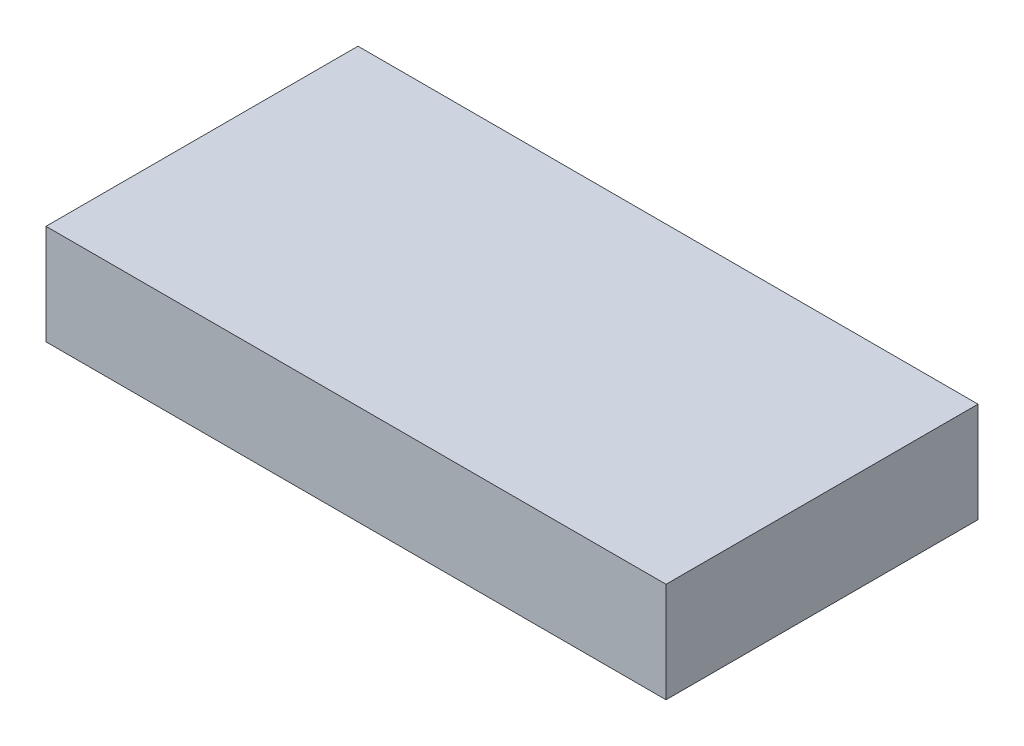
ISO-10303-21;
HEADER;
FILE_DESCRIPTION(('STEP AP214'),'2;1');
FILE_NAME('part.step','',(''),(''),'','','');
FILE_SCHEMA(('AUTOMOTIVE_DESIGN { 1 0 10303 214 1 1 1 1 }'));
ENDSEC;
DATA;
#1=APPLICATION_CONTEXT('core data for automotive mechanical design processes');
#2=APPLICATION_PROTOCOL_DEFINITION('international standard','automotive_design',2000,#1);
#3=PRODUCT_CONTEXT('',#1,'mechanical');
#4=PRODUCT('Part','Part','',(#3));
#5=PRODUCT_RELATED_PRODUCT_CATEGORY('part','',(#4));
#6=PRODUCT_DEFINITION_FORMATION('','',#4);
#7=PRODUCT_DEFINITION_CONTEXT('part definition',#1,'design');
#8=PRODUCT_DEFINITION('design','',#6,#7);
#9=PRODUCT_DEFINITION_SHAPE('','',#8);
#10=(LENGTH_UNIT() NAMED_UNIT(*) SI_UNIT(.MILLI.,.METRE.));
#11=(NAMED_UNIT(*) PLANE_ANGLE_UNIT() SI_UNIT($,.RADIAN.));
#12=(NAMED_UNIT(*) SI_UNIT($,.STERADIAN.) SOLID_ANGLE_UNIT());
#13=UNCERTAINTY_MEASURE_WITH_UNIT(LENGTH_MEASURE(1.E-05),#10,'distance_accuracy_value','');
#14=(GEOMETRIC_REPRESENTATION_CONTEXT(3) GLOBAL_UNCERTAINTY_ASSIGNED_CONTEXT((#13)) GLOBAL_UNIT_ASSIGNED_CONTEXT((#10,
#11,#12)) REPRESENTATION_CONTEXT('',''));
#15=CARTESIAN_POINT('',(0.,0.,0.));
#16=DIRECTION('',(0.,0.,1.));
#17=DIRECTION('',(1.,0.,0.));
#18=AXIS2_PLACEMENT_3D('',#15,#16,#17);
#19=CARTESIAN_POINT('',(0.,0.,0.));
#20=DIRECTION('',(0.,1.,0.));
#21=DIRECTION('',(1.,0.,0.));
#22=AXIS2_PLACEMENT_3D('',#19,#20,#21);
#23=PLANE('',#22);
#24=DIRECTION('',(-1.,0.,0.));
#25=VECTOR('',#24,1.);
#26=CARTESIAN_POINT('',(-1.58,0.,0.795));
#27=LINE('',#26,#25);
#28=CARTESIAN_POINT('',(1.58,0.,0.795));
#29=VERTEX_POINT('',#28);
#30=CARTESIAN_POINT('',(-1.58,0.,0.795));
#31=VERTEX_POINT('',#30);
#32=EDGE_CURVE('E78',#29,#31,#27,.T.);
#33=ORIENTED_EDGE('',*,*,#32,.T.);
#34=DIRECTION('',(0.,0.,-1.));
#35=VECTOR('',#34,1.);
#36=CARTESIAN_POINT('',(-1.58,0.,-0.795));
#37=LINE('',#36,#35);
#38=CARTESIAN_POINT('',(-1.58,0.,-0.795));
#39=VERTEX_POINT('',#38);
#40=EDGE_CURVE('E21',#31,#39,#37,.T.);
#41=ORIENTED_EDGE('',*,*,#40,.T.);
#42=DIRECTION('',(1.,0.,0.));
#43=VECTOR('',#42,1.);
#44=CARTESIAN_POINT('',(-1.58,0.,-0.795));
#45=LINE('',#44,#43);
#46=CARTESIAN_POINT('',(1.58,0.,-0.795));
#47=VERTEX_POINT('',#46);
#48=EDGE_CURVE('E28',#39,#47,#45,.T.);
#49=ORIENTED_EDGE('',*,*,#48,.T.);
#50=DIRECTION('',(0.,0.,1.));
#51=VECTOR('',#50,1.);
#52=CARTESIAN_POINT('',(1.58,0.,-0.795));
#53=LINE('',#52,#51);
#54=EDGE_CURVE('E11',#47,#29,#53,.T.);
#55=ORIENTED_EDGE('',*,*,#54,.T.);
#56=EDGE_LOOP('',(#33,#41,#49,#55));
#57=FACE_BOUND('',#56,.T.);
#58=ADVANCED_FACE('F17',(#57),#23,.F.);
#59=CARTESIAN_POINT('',(1.58,0.51,-0.795));
#60=DIRECTION('',(-1.,0.,0.));
#61=DIRECTION('',(0.,0.,1.));
#62=AXIS2_PLACEMENT_3D('',#59,#60,#61);
#63=PLANE('',#62);
#64=DIRECTION('',(0.,1.,0.));
#65=VECTOR('',#64,1.);
#66=CARTESIAN_POINT('',(1.58,0.51,-0.795));
#67=LINE('',#66,#65);
#68=CARTESIAN_POINT('',(1.58,0.51,-0.795));
#69=VERTEX_POINT('',#68);
#70=EDGE_CURVE('E76',#47,#69,#67,.T.);
#71=ORIENTED_EDGE('',*,*,#70,.T.);
#72=DIRECTION('',(0.,0.,-1.));
#73=VECTOR('',#72,1.);
#74=CARTESIAN_POINT('',(1.58,0.51,0.));
#75=LINE('',#74,#73);
#76=CARTESIAN_POINT('',(1.58,0.51,0.795));
#77=VERTEX_POINT('',#76);
#78=EDGE_CURVE('E99',#77,#69,#75,.T.);
#79=ORIENTED_EDGE('',*,*,#78,.F.);
#80=DIRECTION('',(0.,-1.,0.));
#81=VECTOR('',#80,1.);
#82=CARTESIAN_POINT('',(1.58,0.51,0.795));
#83=LINE('',#82,#81);
#84=EDGE_CURVE('E85',#77,#29,#83,.T.);
#85=ORIENTED_EDGE('',*,*,#84,.T.);
#86=ORIENTED_EDGE('',*,*,#54,.F.);
#87=EDGE_LOOP('',(#71,#79,#85,#86));
#88=FACE_BOUND('',#87,.T.);
#89=ADVANCED_FACE('F151',(#88),#63,.F.);
#90=CARTESIAN_POINT('',(-1.58,0.51,-0.795));
#91=DIRECTION('',(0.,0.,1.));
#92=DIRECTION('',(1.,0.,0.));
#93=AXIS2_PLACEMENT_3D('',#90,#91,#92);
#94=PLANE('',#93);
#95=DIRECTION('',(0.,1.,0.));
#96=VECTOR('',#95,1.);
#97=CARTESIAN_POINT('',(-1.58,0.51,-0.795));
#98=LINE('',#97,#96);
#99=CARTESIAN_POINT('',(-1.58,0.51,-0.795));
#100=VERTEX_POINT('',#99);
#101=EDGE_CURVE('E73',#39,#100,#98,.T.);
#102=ORIENTED_EDGE('',*,*,#101,.T.);
#103=DIRECTION('',(-1.,0.,0.));
#104=VECTOR('',#103,1.);
#105=CARTESIAN_POINT('',(0.,0.51,-0.795));
#106=LINE('',#105,#104);
#107=EDGE_CURVE('E91',#69,#100,#106,.T.);
#108=ORIENTED_EDGE('',*,*,#107,.F.);
#109=ORIENTED_EDGE('',*,*,#70,.F.);
#110=ORIENTED_EDGE('',*,*,#48,.F.);
#111=EDGE_LOOP('',(#102,#108,#109,#110));
#112=FACE_BOUND('',#111,.T.);
#113=ADVANCED_FACE('F105',(#112),#94,.F.);
#114=CARTESIAN_POINT('',(-1.58,0.51,-0.795));
#115=DIRECTION('',(1.,0.,0.));
#116=DIRECTION('',(0.,1.,0.));
#117=AXIS2_PLACEMENT_3D('',#114,#115,#116);
#118=PLANE('',#117);
#119=DIRECTION('',(0.,1.,0.));
#120=VECTOR('',#119,1.);
#121=CARTESIAN_POINT('',(-1.58,0.51,0.795));
#122=LINE('',#121,#120);
#123=CARTESIAN_POINT('',(-1.58,0.51,0.795));
#124=VERTEX_POINT('',#123);
#125=EDGE_CURVE('E71',#31,#124,#122,.T.);
#126=ORIENTED_EDGE('',*,*,#125,.T.);
#127=DIRECTION('',(0.,0.,1.));
#128=VECTOR('',#127,1.);
#129=CARTESIAN_POINT('',(-1.58,0.51,0.));
#130=LINE('',#129,#128);
#131=EDGE_CURVE('E110',#100,#124,#130,.T.);
#132=ORIENTED_EDGE('',*,*,#131,.F.);
#133=ORIENTED_EDGE('',*,*,#101,.F.);
#134=ORIENTED_EDGE('',*,*,#40,.F.);
#135=EDGE_LOOP('',(#126,#132,#133,#134));
#136=FACE_BOUND('',#135,.T.);
#137=ADVANCED_FACE('F68',(#136),#118,.F.);
#138=CARTESIAN_POINT('',(-1.58,0.51,0.795));
#139=DIRECTION('',(0.,0.,-1.));
#140=DIRECTION('',(0.,-1.,0.));
#141=AXIS2_PLACEMENT_3D('',#138,#139,#140);
#142=PLANE('',#141);
#143=ORIENTED_EDGE('',*,*,#84,.F.);
#144=DIRECTION('',(1.,0.,0.));
#145=VECTOR('',#144,1.);
#146=CARTESIAN_POINT('',(0.,0.51,0.795));
#147=LINE('',#146,#145);
#148=EDGE_CURVE('E82',#124,#77,#147,.T.);
#149=ORIENTED_EDGE('',*,*,#148,.F.);
#150=ORIENTED_EDGE('',*,*,#125,.F.);
#151=ORIENTED_EDGE('',*,*,#32,.F.);
#152=EDGE_LOOP('',(#143,#149,#150,#151));
#153=FACE_BOUND('',#152,.T.);
#154=ADVANCED_FACE('F19',(#153),#142,.F.);
#155=CARTESIAN_POINT('',(0.,0.51,0.));
#156=DIRECTION('',(0.,1.,0.));
#157=DIRECTION('',(1.,0.,0.));
#158=AXIS2_PLACEMENT_3D('',#155,#156,#157);
#159=PLANE('',#158);
#160=ORIENTED_EDGE('',*,*,#131,.T.);
#161=ORIENTED_EDGE('',*,*,#148,.T.);
#162=ORIENTED_EDGE('',*,*,#78,.T.);
#163=ORIENTED_EDGE('',*,*,#107,.T.);
#164=EDGE_LOOP('',(#160,#161,#162,#163));
#165=FACE_BOUND('',#164,.T.);
#166=ADVANCED_FACE('F109',(#165),#159,.T.);
#167=CLOSED_SHELL('',(#58,#89,#113,#137,#154,#166));
#168=MANIFOLD_SOLID_BREP('B1',#167);
#169=ADVANCED_BREP_SHAPE_REPRESENTATION('',(#18,#168),#14);
#170=SHAPE_DEFINITION_REPRESENTATION(#9,#169);
ENDSEC;
END-ISO-10303-21;
